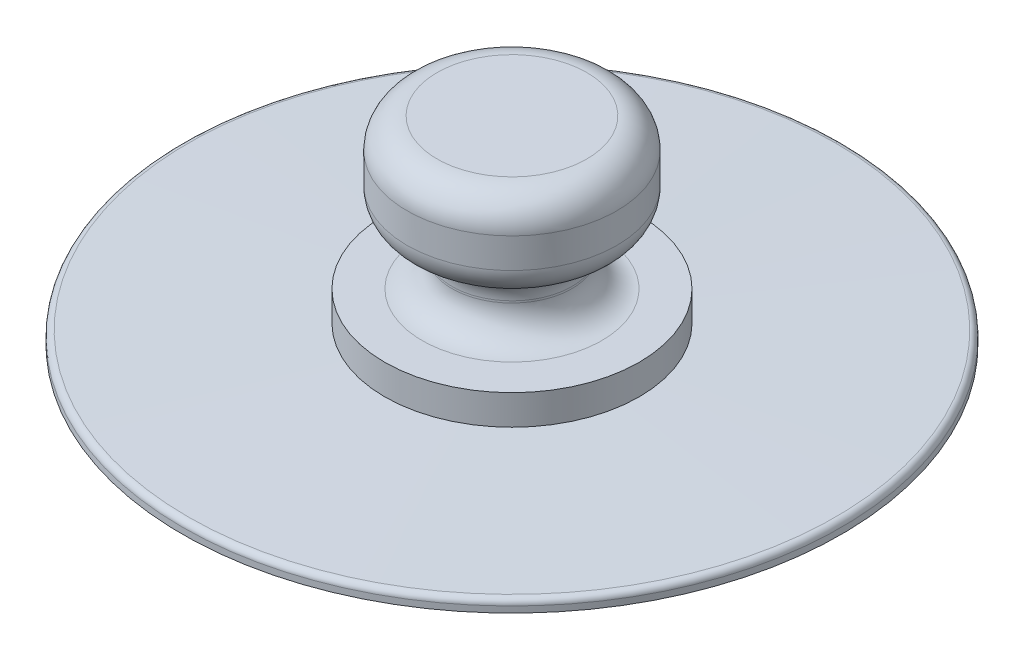
ISO-10303-21;
HEADER;
FILE_DESCRIPTION(('STEP AP214'),'2;1');
FILE_NAME('part.step','',(''),(''),'','','');
FILE_SCHEMA(('AUTOMOTIVE_DESIGN { 1 0 10303 214 1 1 1 1 }'));
ENDSEC;
DATA;
#1=APPLICATION_CONTEXT('core data for automotive mechanical design processes');
#2=APPLICATION_PROTOCOL_DEFINITION('international standard','automotive_design',2000,#1);
#3=PRODUCT_CONTEXT('',#1,'mechanical');
#4=PRODUCT('Part','Part','',(#3));
#5=PRODUCT_RELATED_PRODUCT_CATEGORY('part','',(#4));
#6=PRODUCT_DEFINITION_FORMATION('','',#4);
#7=PRODUCT_DEFINITION_CONTEXT('part definition',#1,'design');
#8=PRODUCT_DEFINITION('design','',#6,#7);
#9=PRODUCT_DEFINITION_SHAPE('','',#8);
#10=(LENGTH_UNIT() NAMED_UNIT(*) SI_UNIT(.MILLI.,.METRE.));
#11=(NAMED_UNIT(*) PLANE_ANGLE_UNIT() SI_UNIT($,.RADIAN.));
#12=(NAMED_UNIT(*) SI_UNIT($,.STERADIAN.) SOLID_ANGLE_UNIT());
#13=UNCERTAINTY_MEASURE_WITH_UNIT(LENGTH_MEASURE(1.E-05),#10,'distance_accuracy_value','');
#14=(GEOMETRIC_REPRESENTATION_CONTEXT(3) GLOBAL_UNCERTAINTY_ASSIGNED_CONTEXT((#13)) GLOBAL_UNIT_ASSIGNED_CONTEXT((#10,
#11,#12)) REPRESENTATION_CONTEXT('',''));
#15=CARTESIAN_POINT('',(0.,0.,0.));
#16=DIRECTION('',(0.,0.,1.));
#17=DIRECTION('',(1.,0.,0.));
#18=AXIS2_PLACEMENT_3D('',#15,#16,#17);
#19=CARTESIAN_POINT('',(0.,0.,0.));
#20=DIRECTION('',(0.,-1.,0.));
#21=DIRECTION('',(0.,0.,-1.));
#22=AXIS2_PLACEMENT_3D('',#19,#20,#21);
#23=CYLINDRICAL_SURFACE('',#22,11.);
#24=CARTESIAN_POINT('',(0.,0.20583815369064,0.));
#25=DIRECTION('',(0.,1.,0.));
#26=DIRECTION('',(0.,0.,1.));
#27=AXIS2_PLACEMENT_3D('',#24,#25,#26);
#28=CIRCLE('',#27,11.);
#29=CARTESIAN_POINT('',(0.,0.20583815369064,11.));
#30=VERTEX_POINT('',#29);
#31=EDGE_CURVE('E40',#30,#30,#28,.F.);
#32=ORIENTED_EDGE('',*,*,#31,.T.);
#33=EDGE_LOOP('',(#32));
#34=FACE_BOUND('',#33,.T.);
#35=CARTESIAN_POINT('',(0.,0.,0.));
#36=DIRECTION('',(0.,-1.,0.));
#37=DIRECTION('',(0.,0.,-1.));
#38=AXIS2_PLACEMENT_3D('',#35,#36,#37);
#39=CIRCLE('',#38,11.);
#40=CARTESIAN_POINT('',(0.,0.,-11.));
#41=VERTEX_POINT('',#40);
#42=EDGE_CURVE('E53',#41,#41,#39,.T.);
#43=ORIENTED_EDGE('',*,*,#42,.F.);
#44=EDGE_LOOP('',(#43));
#45=FACE_BOUND('',#44,.T.);
#46=ADVANCED_FACE('F33',(#34,#45),#23,.T.);
#47=CARTESIAN_POINT('',(0.,0.,11.));
#48=DIRECTION('',(0.,1.,0.));
#49=DIRECTION('',(0.,0.,1.));
#50=AXIS2_PLACEMENT_3D('',#47,#48,#49);
#51=PLANE('',#50);
#52=CARTESIAN_POINT('',(0.,0.,0.));
#53=DIRECTION('',(0.,-1.,0.));
#54=DIRECTION('',(0.,0.,-1.));
#55=AXIS2_PLACEMENT_3D('',#52,#53,#54);
#56=CIRCLE('',#55,10.);
#57=CARTESIAN_POINT('',(0.,0.,-10.));
#58=VERTEX_POINT('',#57);
#59=EDGE_CURVE('E51',#58,#58,#56,.T.);
#60=ORIENTED_EDGE('',*,*,#59,.F.);
#61=EDGE_LOOP('',(#60));
#62=FACE_BOUND('',#61,.T.);
#63=ORIENTED_EDGE('',*,*,#42,.T.);
#64=EDGE_LOOP('',(#63));
#65=FACE_BOUND('',#64,.T.);
#66=ADVANCED_FACE('F47',(#62,#65),#51,.F.);
#67=CARTESIAN_POINT('',(0.,0.,0.));
#68=DIRECTION('',(0.,-1.,0.));
#69=DIRECTION('',(0.,0.,-1.));
#70=AXIS2_PLACEMENT_3D('',#67,#68,#69);
#71=CONICAL_SURFACE('',#70,10.,1.56079666010823);
#72=CARTESIAN_POINT('',(0.,0.100000000000001,0.));
#73=VERTEX_POINT('',#72);
#74=VERTEX_LOOP('',#73);
#75=FACE_BOUND('',#74,.T.);
#76=ORIENTED_EDGE('',*,*,#59,.T.);
#77=EDGE_LOOP('',(#76));
#78=FACE_BOUND('',#77,.T.);
#79=ADVANCED_FACE('F43',(#75,#78),#71,.F.);
#80=CARTESIAN_POINT('',(0.,6.6,0.));
#81=DIRECTION('',(0.,-1.,0.));
#82=DIRECTION('',(0.,0.,-1.));
#83=AXIS2_PLACEMENT_3D('',#80,#81,#82);
#84=PLANE('',#83);
#85=CARTESIAN_POINT('',(0.,6.6,0.));
#86=DIRECTION('',(0.,-1.,0.));
#87=DIRECTION('',(0.,0.,-1.));
#88=AXIS2_PLACEMENT_3D('',#85,#86,#87);
#89=CIRCLE('',#88,2.5);
#90=CARTESIAN_POINT('',(0.,6.6,-2.5));
#91=VERTEX_POINT('',#90);
#92=EDGE_CURVE('E69',#91,#91,#89,.F.);
#93=ORIENTED_EDGE('',*,*,#92,.T.);
#94=EDGE_LOOP('',(#93));
#95=FACE_BOUND('',#94,.T.);
#96=ADVANCED_FACE('F46',(#95),#84,.F.);
#97=CARTESIAN_POINT('',(0.,0.,0.));
#98=DIRECTION('',(0.,-1.,0.));
#99=DIRECTION('',(0.,0.,-1.));
#100=AXIS2_PLACEMENT_3D('',#97,#98,#99);
#101=CYLINDRICAL_SURFACE('',#100,3.5);
#102=CARTESIAN_POINT('',(0.,4.6,0.));
#103=DIRECTION('',(0.,1.,0.));
#104=DIRECTION('',(0.,0.,1.));
#105=AXIS2_PLACEMENT_3D('',#102,#103,#104);
#106=CIRCLE('',#105,3.5);
#107=CARTESIAN_POINT('',(0.,4.6,3.5));
#108=VERTEX_POINT('',#107);
#109=EDGE_CURVE('E66',#108,#108,#106,.T.);
#110=ORIENTED_EDGE('',*,*,#109,.T.);
#111=EDGE_LOOP('',(#110));
#112=FACE_BOUND('',#111,.T.);
#113=CARTESIAN_POINT('',(0.,5.6,0.));
#114=DIRECTION('',(0.,-1.,0.));
#115=DIRECTION('',(0.,0.,-1.));
#116=AXIS2_PLACEMENT_3D('',#113,#114,#115);
#117=CIRCLE('',#116,3.5);
#118=CARTESIAN_POINT('',(0.,5.6,-3.5));
#119=VERTEX_POINT('',#118);
#120=EDGE_CURVE('E57',#119,#119,#117,.T.);
#121=ORIENTED_EDGE('',*,*,#120,.T.);
#122=EDGE_LOOP('',(#121));
#123=FACE_BOUND('',#122,.T.);
#124=ADVANCED_FACE('F141',(#112,#123),#101,.T.);
#125=CARTESIAN_POINT('',(0.,0.,0.));
#126=DIRECTION('',(0.,-1.,0.));
#127=DIRECTION('',(0.,0.,-1.));
#128=AXIS2_PLACEMENT_3D('',#125,#126,#127);
#129=CYLINDRICAL_SURFACE('',#128,2.);
#130=CARTESIAN_POINT('',(0.,2.6,0.));
#131=DIRECTION('',(0.,-1.,0.));
#132=DIRECTION('',(0.,0.,-1.));
#133=AXIS2_PLACEMENT_3D('',#130,#131,#132);
#134=CIRCLE('',#133,2.);
#135=CARTESIAN_POINT('',(0.,2.6,-2.));
#136=VERTEX_POINT('',#135);
#137=EDGE_CURVE('E78',#136,#136,#134,.F.);
#138=ORIENTED_EDGE('',*,*,#137,.T.);
#139=EDGE_LOOP('',(#138));
#140=FACE_BOUND('',#139,.T.);
#141=CARTESIAN_POINT('',(0.,2.66350832689629,0.));
#142=DIRECTION('',(0.,-1.,0.));
#143=DIRECTION('',(0.,0.,-1.));
#144=AXIS2_PLACEMENT_3D('',#141,#142,#143);
#145=CIRCLE('',#144,2.);
#146=CARTESIAN_POINT('',(0.,2.66350832689629,-2.));
#147=VERTEX_POINT('',#146);
#148=EDGE_CURVE('E75',#147,#147,#145,.T.);
#149=ORIENTED_EDGE('',*,*,#148,.T.);
#150=EDGE_LOOP('',(#149));
#151=FACE_BOUND('',#150,.T.);
#152=ADVANCED_FACE('F125',(#140,#151),#129,.T.);
#153=CARTESIAN_POINT('',(0.,1.6,2.));
#154=DIRECTION('',(0.,-1.,0.));
#155=DIRECTION('',(0.,0.,-1.));
#156=AXIS2_PLACEMENT_3D('',#153,#154,#155);
#157=PLANE('',#156);
#158=CARTESIAN_POINT('',(0.,1.6,0.));
#159=DIRECTION('',(0.,-1.,0.));
#160=DIRECTION('',(0.,0.,-1.));
#161=AXIS2_PLACEMENT_3D('',#158,#159,#160);
#162=CIRCLE('',#161,3.);
#163=CARTESIAN_POINT('',(0.,1.6,-3.));
#164=VERTEX_POINT('',#163);
#165=EDGE_CURVE('E72',#164,#164,#162,.T.);
#166=ORIENTED_EDGE('',*,*,#165,.T.);
#167=EDGE_LOOP('',(#166));
#168=FACE_BOUND('',#167,.T.);
#169=CARTESIAN_POINT('',(0.,1.6,0.));
#170=DIRECTION('',(0.,-1.,0.));
#171=DIRECTION('',(0.,0.,-1.));
#172=AXIS2_PLACEMENT_3D('',#169,#170,#171);
#173=CIRCLE('',#172,4.25);
#174=CARTESIAN_POINT('',(0.,1.6,-4.25));
#175=VERTEX_POINT('',#174);
#176=EDGE_CURVE('E54',#175,#175,#173,.T.);
#177=ORIENTED_EDGE('',*,*,#176,.F.);
#178=EDGE_LOOP('',(#177));
#179=FACE_BOUND('',#178,.T.);
#180=ADVANCED_FACE('F121',(#168,#179),#157,.F.);
#181=CARTESIAN_POINT('',(0.,0.,0.));
#182=DIRECTION('',(0.,-1.,0.));
#183=DIRECTION('',(0.,0.,-1.));
#184=AXIS2_PLACEMENT_3D('',#181,#182,#183);
#185=CYLINDRICAL_SURFACE('',#184,4.25);
#186=CARTESIAN_POINT('',(0.,0.600000000000001,0.));
#187=DIRECTION('',(0.,-1.,0.));
#188=DIRECTION('',(0.,0.,-1.));
#189=AXIS2_PLACEMENT_3D('',#186,#187,#188);
#190=CIRCLE('',#189,4.25);
#191=CARTESIAN_POINT('',(0.,0.600000000000001,-4.25));
#192=VERTEX_POINT('',#191);
#193=EDGE_CURVE('E60',#192,#192,#190,.T.);
#194=ORIENTED_EDGE('',*,*,#193,.F.);
#195=EDGE_LOOP('',(#194));
#196=FACE_BOUND('',#195,.T.);
#197=ORIENTED_EDGE('',*,*,#176,.T.);
#198=EDGE_LOOP('',(#197));
#199=FACE_BOUND('',#198,.T.);
#200=ADVANCED_FACE('F124',(#196,#199),#185,.T.);
#201=CARTESIAN_POINT('',(0.,0.600000000000001,0.));
#202=DIRECTION('',(0.,-1.,0.));
#203=DIRECTION('',(0.,0.,-1.));
#204=AXIS2_PLACEMENT_3D('',#201,#202,#203);
#205=CONICAL_SURFACE('',#204,4.25,1.54117536336577);
#206=CARTESIAN_POINT('',(0.,0.405750419958283,0.));
#207=DIRECTION('',(0.,1.,0.));
#208=DIRECTION('',(0.,0.,1.));
#209=AXIS2_PLACEMENT_3D('',#206,#207,#208);
#210=CIRCLE('',#209,10.8059233264079);
#211=CARTESIAN_POINT('',(0.,0.405750419958283,10.8059233264079));
#212=VERTEX_POINT('',#211);
#213=EDGE_CURVE('E11',#212,#212,#210,.T.);
#214=ORIENTED_EDGE('',*,*,#213,.T.);
#215=EDGE_LOOP('',(#214));
#216=FACE_BOUND('',#215,.T.);
#217=ORIENTED_EDGE('',*,*,#193,.T.);
#218=EDGE_LOOP('',(#217));
#219=FACE_BOUND('',#218,.T.);
#220=ADVANCED_FACE('F108',(#216,#219),#205,.T.);
#221=CARTESIAN_POINT('',(0.,4.6,0.));
#222=DIRECTION('',(0.,1.,0.));
#223=DIRECTION('',(0.,0.,1.));
#224=AXIS2_PLACEMENT_3D('',#221,#222,#223);
#225=TOROIDAL_SURFACE('',#224,2.5,1.);
#226=CARTESIAN_POINT('',(0.,3.63175416344814,0.));
#227=DIRECTION('',(0.,1.,0.));
#228=DIRECTION('',(0.,0.,1.));
#229=AXIS2_PLACEMENT_3D('',#226,#227,#228);
#230=CIRCLE('',#229,2.75);
#231=CARTESIAN_POINT('',(0.,3.63175416344814,2.75));
#232=VERTEX_POINT('',#231);
#233=EDGE_CURVE('E81',#232,#232,#230,.T.);
#234=ORIENTED_EDGE('',*,*,#233,.T.);
#235=EDGE_LOOP('',(#234));
#236=FACE_BOUND('',#235,.T.);
#237=ORIENTED_EDGE('',*,*,#109,.F.);
#238=EDGE_LOOP('',(#237));
#239=FACE_BOUND('',#238,.T.);
#240=ADVANCED_FACE('F104',(#236,#239),#225,.T.);
#241=CARTESIAN_POINT('',(0.,5.6,0.));
#242=DIRECTION('',(0.,-1.,0.));
#243=DIRECTION('',(0.,0.,-1.));
#244=AXIS2_PLACEMENT_3D('',#241,#242,#243);
#245=TOROIDAL_SURFACE('',#244,2.5,1.);
#246=ORIENTED_EDGE('',*,*,#92,.F.);
#247=EDGE_LOOP('',(#246));
#248=FACE_BOUND('',#247,.T.);
#249=ORIENTED_EDGE('',*,*,#120,.F.);
#250=EDGE_LOOP('',(#249));
#251=FACE_BOUND('',#250,.T.);
#252=ADVANCED_FACE('F107',(#248,#251),#245,.T.);
#253=CARTESIAN_POINT('',(0.,2.6,0.));
#254=DIRECTION('',(0.,-1.,0.));
#255=DIRECTION('',(0.,0.,-1.));
#256=AXIS2_PLACEMENT_3D('',#253,#254,#255);
#257=TOROIDAL_SURFACE('',#256,3.,1.);
#258=ORIENTED_EDGE('',*,*,#137,.F.);
#259=EDGE_LOOP('',(#258));
#260=FACE_BOUND('',#259,.T.);
#261=ORIENTED_EDGE('',*,*,#165,.F.);
#262=EDGE_LOOP('',(#261));
#263=FACE_BOUND('',#262,.T.);
#264=ADVANCED_FACE('F94',(#260,#263),#257,.F.);
#265=CARTESIAN_POINT('',(0.,2.66350832689629,0.));
#266=DIRECTION('',(0.,-1.,0.));
#267=DIRECTION('',(0.,0.,-1.));
#268=AXIS2_PLACEMENT_3D('',#265,#266,#267);
#269=TOROIDAL_SURFACE('',#268,3.,1.);
#270=ORIENTED_EDGE('',*,*,#233,.F.);
#271=EDGE_LOOP('',(#270));
#272=FACE_BOUND('',#271,.T.);
#273=ORIENTED_EDGE('',*,*,#148,.F.);
#274=EDGE_LOOP('',(#273));
#275=FACE_BOUND('',#274,.T.);
#276=ADVANCED_FACE('F89',(#272,#275),#269,.F.);
#277=CARTESIAN_POINT('',(0.,0.20583815369064,0.));
#278=DIRECTION('',(0.,1.,0.));
#279=DIRECTION('',(0.,0.,1.));
#280=AXIS2_PLACEMENT_3D('',#277,#278,#279);
#281=TOROIDAL_SURFACE('',#280,10.8,0.2);
#282=ORIENTED_EDGE('',*,*,#213,.F.);
#283=EDGE_LOOP('',(#282));
#284=FACE_BOUND('',#283,.T.);
#285=ORIENTED_EDGE('',*,*,#31,.F.);
#286=EDGE_LOOP('',(#285));
#287=FACE_BOUND('',#286,.T.);
#288=ADVANCED_FACE('F35',(#284,#287),#281,.T.);
#289=CLOSED_SHELL('',(#46,#66,#79,#96,#124,#152,#180,#200,#220,#240,#252,#264,#276,#288));
#290=MANIFOLD_SOLID_BREP('B2',#289);
#291=ADVANCED_BREP_SHAPE_REPRESENTATION('',(#18,#290),#14);
#292=SHAPE_DEFINITION_REPRESENTATION(#9,#291);
ENDSEC;
END-ISO-10303-21;
